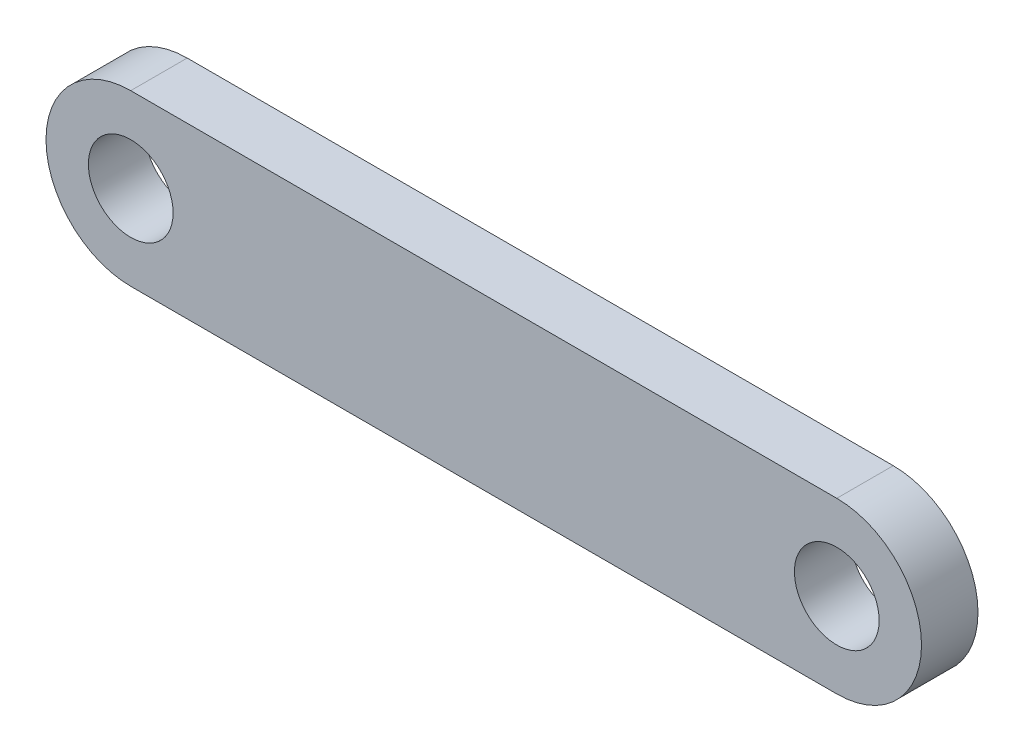
ISO-10303-21;
HEADER;
FILE_DESCRIPTION(('STEP AP214'),'2;1');
FILE_NAME('part.step','',(''),(''),'','','');
FILE_SCHEMA(('AUTOMOTIVE_DESIGN { 1 0 10303 214 1 1 1 1 }'));
ENDSEC;
DATA;
#1=APPLICATION_CONTEXT('core data for automotive mechanical design processes');
#2=APPLICATION_PROTOCOL_DEFINITION('international standard','automotive_design',2000,#1);
#3=PRODUCT_CONTEXT('',#1,'mechanical');
#4=PRODUCT('Part','Part','',(#3));
#5=PRODUCT_RELATED_PRODUCT_CATEGORY('part','',(#4));
#6=PRODUCT_DEFINITION_FORMATION('','',#4);
#7=PRODUCT_DEFINITION_CONTEXT('part definition',#1,'design');
#8=PRODUCT_DEFINITION('design','',#6,#7);
#9=PRODUCT_DEFINITION_SHAPE('','',#8);
#10=(LENGTH_UNIT() NAMED_UNIT(*) SI_UNIT(.MILLI.,.METRE.));
#11=(NAMED_UNIT(*) PLANE_ANGLE_UNIT() SI_UNIT($,.RADIAN.));
#12=(NAMED_UNIT(*) SI_UNIT($,.STERADIAN.) SOLID_ANGLE_UNIT());
#13=UNCERTAINTY_MEASURE_WITH_UNIT(LENGTH_MEASURE(1.E-05),#10,'distance_accuracy_value','');
#14=(GEOMETRIC_REPRESENTATION_CONTEXT(3) GLOBAL_UNCERTAINTY_ASSIGNED_CONTEXT((#13)) GLOBAL_UNIT_ASSIGNED_CONTEXT((#10,
#11,#12)) REPRESENTATION_CONTEXT('',''));
#15=CARTESIAN_POINT('',(0.,0.,0.));
#16=DIRECTION('',(0.,0.,1.));
#17=DIRECTION('',(1.,0.,0.));
#18=AXIS2_PLACEMENT_3D('',#15,#16,#17);
#19=CARTESIAN_POINT('',(25.,0.,4.));
#20=DIRECTION('',(0.,0.,-1.));
#21=DIRECTION('',(-1.,0.,0.));
#22=AXIS2_PLACEMENT_3D('',#19,#20,#21);
#23=CYLINDRICAL_SURFACE('',#22,3.);
#24=CARTESIAN_POINT('',(25.,0.,2.));
#25=DIRECTION('',(0.,0.,1.));
#26=DIRECTION('',(1.,0.,0.));
#27=AXIS2_PLACEMENT_3D('',#24,#25,#26);
#28=CIRCLE('',#27,3.);
#29=CARTESIAN_POINT('',(25.,3.,2.));
#30=VERTEX_POINT('',#29);
#31=CARTESIAN_POINT('',(25.,-3.,2.));
#32=VERTEX_POINT('',#31);
#33=EDGE_CURVE('E50',#30,#32,#28,.F.);
#34=ORIENTED_EDGE('',*,*,#33,.F.);
#35=DIRECTION('',(0.,0.,-1.));
#36=VECTOR('',#35,1.);
#37=CARTESIAN_POINT('',(25.,3.,4.));
#38=LINE('',#37,#36);
#39=CARTESIAN_POINT('',(25.,3.,4.));
#40=VERTEX_POINT('',#39);
#41=EDGE_CURVE('E11',#40,#30,#38,.T.);
#42=ORIENTED_EDGE('',*,*,#41,.F.);
#43=CARTESIAN_POINT('',(25.,0.,4.));
#44=DIRECTION('',(0.,0.,1.));
#45=DIRECTION('',(1.,0.,0.));
#46=AXIS2_PLACEMENT_3D('',#43,#44,#45);
#47=CIRCLE('',#46,3.);
#48=CARTESIAN_POINT('',(25.,-3.,4.));
#49=VERTEX_POINT('',#48);
#50=EDGE_CURVE('E93',#40,#49,#47,.F.);
#51=ORIENTED_EDGE('',*,*,#50,.T.);
#52=DIRECTION('',(0.,0.,-1.));
#53=VECTOR('',#52,1.);
#54=CARTESIAN_POINT('',(25.,-3.,4.));
#55=LINE('',#54,#53);
#56=EDGE_CURVE('E57',#49,#32,#55,.T.);
#57=ORIENTED_EDGE('',*,*,#56,.T.);
#58=EDGE_LOOP('',(#34,#42,#51,#57));
#59=FACE_BOUND('',#58,.T.);
#60=ADVANCED_FACE('F35',(#59),#23,.T.);
#61=CARTESIAN_POINT('',(0.,3.,4.));
#62=DIRECTION('',(0.,1.,0.));
#63=DIRECTION('',(-1.,0.,0.));
#64=AXIS2_PLACEMENT_3D('',#61,#62,#63);
#65=PLANE('',#64);
#66=DIRECTION('',(1.,0.,0.));
#67=VECTOR('',#66,1.);
#68=CARTESIAN_POINT('',(0.,3.,2.));
#69=LINE('',#68,#67);
#70=CARTESIAN_POINT('',(0.,3.,2.));
#71=VERTEX_POINT('',#70);
#72=EDGE_CURVE('E75',#71,#30,#69,.T.);
#73=ORIENTED_EDGE('',*,*,#72,.F.);
#74=DIRECTION('',(0.,0.,-1.));
#75=VECTOR('',#74,1.);
#76=CARTESIAN_POINT('',(0.,3.,4.));
#77=LINE('',#76,#75);
#78=CARTESIAN_POINT('',(0.,3.,4.));
#79=VERTEX_POINT('',#78);
#80=EDGE_CURVE('E43',#79,#71,#77,.T.);
#81=ORIENTED_EDGE('',*,*,#80,.F.);
#82=DIRECTION('',(1.,0.,0.));
#83=VECTOR('',#82,1.);
#84=CARTESIAN_POINT('',(0.,3.,4.));
#85=LINE('',#84,#83);
#86=EDGE_CURVE('E89',#79,#40,#85,.T.);
#87=ORIENTED_EDGE('',*,*,#86,.T.);
#88=ORIENTED_EDGE('',*,*,#41,.T.);
#89=EDGE_LOOP('',(#73,#81,#87,#88));
#90=FACE_BOUND('',#89,.T.);
#91=ADVANCED_FACE('F87',(#90),#65,.T.);
#92=CARTESIAN_POINT('',(0.,0.,4.));
#93=DIRECTION('',(0.,0.,-1.));
#94=DIRECTION('',(-1.,0.,0.));
#95=AXIS2_PLACEMENT_3D('',#92,#93,#94);
#96=CYLINDRICAL_SURFACE('',#95,3.);
#97=ORIENTED_EDGE('',*,*,#80,.T.);
#98=CARTESIAN_POINT('',(0.,0.,2.));
#99=DIRECTION('',(0.,0.,1.));
#100=DIRECTION('',(1.,0.,0.));
#101=AXIS2_PLACEMENT_3D('',#98,#99,#100);
#102=CIRCLE('',#101,3.);
#103=CARTESIAN_POINT('',(0.,-3.,2.));
#104=VERTEX_POINT('',#103);
#105=EDGE_CURVE('E78',#71,#104,#102,.T.);
#106=ORIENTED_EDGE('',*,*,#105,.T.);
#107=DIRECTION('',(0.,0.,-1.));
#108=VECTOR('',#107,1.);
#109=CARTESIAN_POINT('',(0.,-3.,4.));
#110=LINE('',#109,#108);
#111=CARTESIAN_POINT('',(0.,-3.,4.));
#112=VERTEX_POINT('',#111);
#113=EDGE_CURVE('E103',#112,#104,#110,.T.);
#114=ORIENTED_EDGE('',*,*,#113,.F.);
#115=CARTESIAN_POINT('',(0.,0.,4.));
#116=DIRECTION('',(0.,0.,1.));
#117=DIRECTION('',(1.,0.,0.));
#118=AXIS2_PLACEMENT_3D('',#115,#116,#117);
#119=CIRCLE('',#118,3.);
#120=EDGE_CURVE('E92',#79,#112,#119,.T.);
#121=ORIENTED_EDGE('',*,*,#120,.F.);
#122=EDGE_LOOP('',(#97,#106,#114,#121));
#123=FACE_BOUND('',#122,.T.);
#124=ADVANCED_FACE('F106',(#123),#96,.T.);
#125=CARTESIAN_POINT('',(0.,0.,4.));
#126=DIRECTION('',(0.,0.,-1.));
#127=DIRECTION('',(-1.,0.,0.));
#128=AXIS2_PLACEMENT_3D('',#125,#126,#127);
#129=CYLINDRICAL_SURFACE('',#128,1.5);
#130=CARTESIAN_POINT('',(0.,0.,2.));
#131=DIRECTION('',(0.,0.,1.));
#132=DIRECTION('',(1.,0.,0.));
#133=AXIS2_PLACEMENT_3D('',#130,#131,#132);
#134=CIRCLE('',#133,1.5);
#135=CARTESIAN_POINT('',(1.5,0.,2.));
#136=VERTEX_POINT('',#135);
#137=EDGE_CURVE('E84',#136,#136,#134,.T.);
#138=ORIENTED_EDGE('',*,*,#137,.F.);
#139=EDGE_LOOP('',(#138));
#140=FACE_BOUND('',#139,.T.);
#141=CARTESIAN_POINT('',(0.,0.,4.));
#142=DIRECTION('',(0.,0.,1.));
#143=DIRECTION('',(1.,0.,0.));
#144=AXIS2_PLACEMENT_3D('',#141,#142,#143);
#145=CIRCLE('',#144,1.5);
#146=CARTESIAN_POINT('',(1.5,0.,4.));
#147=VERTEX_POINT('',#146);
#148=EDGE_CURVE('E97',#147,#147,#145,.T.);
#149=ORIENTED_EDGE('',*,*,#148,.T.);
#150=EDGE_LOOP('',(#149));
#151=FACE_BOUND('',#150,.T.);
#152=ADVANCED_FACE('F120',(#140,#151),#129,.F.);
#153=CARTESIAN_POINT('',(25.,0.,4.));
#154=DIRECTION('',(0.,0.,-1.));
#155=DIRECTION('',(-1.,0.,0.));
#156=AXIS2_PLACEMENT_3D('',#153,#154,#155);
#157=CYLINDRICAL_SURFACE('',#156,1.5);
#158=CARTESIAN_POINT('',(25.,0.,2.));
#159=DIRECTION('',(0.,0.,1.));
#160=DIRECTION('',(1.,0.,0.));
#161=AXIS2_PLACEMENT_3D('',#158,#159,#160);
#162=CIRCLE('',#161,1.5);
#163=CARTESIAN_POINT('',(26.5,0.,2.));
#164=VERTEX_POINT('',#163);
#165=EDGE_CURVE('E150',#164,#164,#162,.T.);
#166=ORIENTED_EDGE('',*,*,#165,.F.);
#167=EDGE_LOOP('',(#166));
#168=FACE_BOUND('',#167,.T.);
#169=CARTESIAN_POINT('',(25.,0.,4.));
#170=DIRECTION('',(0.,0.,1.));
#171=DIRECTION('',(1.,0.,0.));
#172=AXIS2_PLACEMENT_3D('',#169,#170,#171);
#173=CIRCLE('',#172,1.5);
#174=CARTESIAN_POINT('',(26.5,0.,4.));
#175=VERTEX_POINT('',#174);
#176=EDGE_CURVE('E112',#175,#175,#173,.T.);
#177=ORIENTED_EDGE('',*,*,#176,.T.);
#178=EDGE_LOOP('',(#177));
#179=FACE_BOUND('',#178,.T.);
#180=ADVANCED_FACE('F37',(#168,#179),#157,.F.);
#181=CARTESIAN_POINT('',(0.,-3.,4.));
#182=DIRECTION('',(0.,-1.,0.));
#183=DIRECTION('',(1.,0.,0.));
#184=AXIS2_PLACEMENT_3D('',#181,#182,#183);
#185=PLANE('',#184);
#186=DIRECTION('',(-1.,0.,0.));
#187=VECTOR('',#186,1.);
#188=CARTESIAN_POINT('',(0.,-3.,2.));
#189=LINE('',#188,#187);
#190=EDGE_CURVE('E111',#32,#104,#189,.T.);
#191=ORIENTED_EDGE('',*,*,#190,.F.);
#192=ORIENTED_EDGE('',*,*,#56,.F.);
#193=DIRECTION('',(-1.,0.,0.));
#194=VECTOR('',#193,1.);
#195=CARTESIAN_POINT('',(0.,-3.,4.));
#196=LINE('',#195,#194);
#197=EDGE_CURVE('E95',#49,#112,#196,.T.);
#198=ORIENTED_EDGE('',*,*,#197,.T.);
#199=ORIENTED_EDGE('',*,*,#113,.T.);
#200=EDGE_LOOP('',(#191,#192,#198,#199));
#201=FACE_BOUND('',#200,.T.);
#202=ADVANCED_FACE('F110',(#201),#185,.T.);
#203=CARTESIAN_POINT('',(0.,0.,4.));
#204=DIRECTION('',(0.,0.,1.));
#205=DIRECTION('',(1.,0.,0.));
#206=AXIS2_PLACEMENT_3D('',#203,#204,#205);
#207=PLANE('',#206);
#208=ORIENTED_EDGE('',*,*,#176,.F.);
#209=EDGE_LOOP('',(#208));
#210=FACE_BOUND('',#209,.T.);
#211=ORIENTED_EDGE('',*,*,#148,.F.);
#212=EDGE_LOOP('',(#211));
#213=FACE_BOUND('',#212,.T.);
#214=ORIENTED_EDGE('',*,*,#50,.F.);
#215=ORIENTED_EDGE('',*,*,#86,.F.);
#216=ORIENTED_EDGE('',*,*,#120,.T.);
#217=ORIENTED_EDGE('',*,*,#197,.F.);
#218=EDGE_LOOP('',(#214,#215,#216,#217));
#219=FACE_BOUND('',#218,.T.);
#220=ADVANCED_FACE('F109',(#210,#213,#219),#207,.T.);
#221=CARTESIAN_POINT('',(0.,0.,2.));
#222=DIRECTION('',(0.,0.,1.));
#223=DIRECTION('',(1.,0.,0.));
#224=AXIS2_PLACEMENT_3D('',#221,#222,#223);
#225=PLANE('',#224);
#226=ORIENTED_EDGE('',*,*,#165,.T.);
#227=EDGE_LOOP('',(#226));
#228=FACE_BOUND('',#227,.T.);
#229=ORIENTED_EDGE('',*,*,#137,.T.);
#230=EDGE_LOOP('',(#229));
#231=FACE_BOUND('',#230,.T.);
#232=ORIENTED_EDGE('',*,*,#33,.T.);
#233=ORIENTED_EDGE('',*,*,#190,.T.);
#234=ORIENTED_EDGE('',*,*,#105,.F.);
#235=ORIENTED_EDGE('',*,*,#72,.T.);
#236=EDGE_LOOP('',(#232,#233,#234,#235));
#237=FACE_BOUND('',#236,.T.);
#238=ADVANCED_FACE('F76',(#228,#231,#237),#225,.F.);
#239=CLOSED_SHELL('',(#60,#91,#124,#152,#180,#202,#220,#238));
#240=MANIFOLD_SOLID_BREP('B2',#239);
#241=ADVANCED_BREP_SHAPE_REPRESENTATION('',(#18,#240),#14);
#242=SHAPE_DEFINITION_REPRESENTATION(#9,#241);
ENDSEC;
END-ISO-10303-21;
